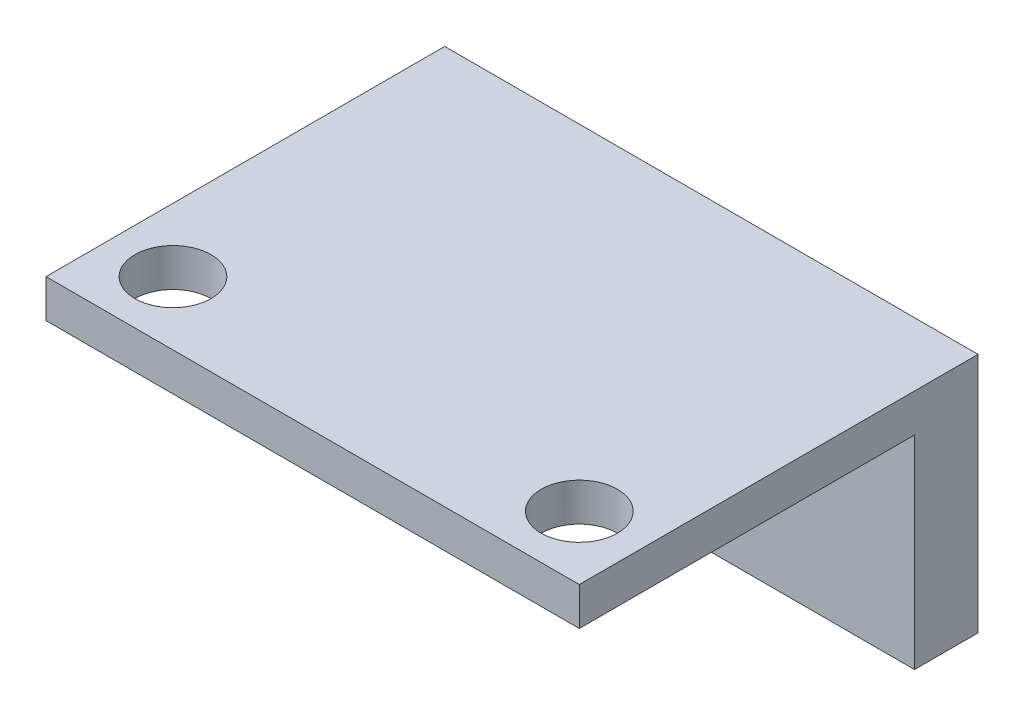
ISO-10303-21;
HEADER;
FILE_DESCRIPTION(('STEP AP214'),'2;1');
FILE_NAME('part.step','',(''),(''),'','','');
FILE_SCHEMA(('AUTOMOTIVE_DESIGN { 1 0 10303 214 1 1 1 1 }'));
ENDSEC;
DATA;
#1=APPLICATION_CONTEXT('core data for automotive mechanical design processes');
#2=APPLICATION_PROTOCOL_DEFINITION('international standard','automotive_design',2000,#1);
#3=PRODUCT_CONTEXT('',#1,'mechanical');
#4=PRODUCT('Part','Part','',(#3));
#5=PRODUCT_RELATED_PRODUCT_CATEGORY('part','',(#4));
#6=PRODUCT_DEFINITION_FORMATION('','',#4);
#7=PRODUCT_DEFINITION_CONTEXT('part definition',#1,'design');
#8=PRODUCT_DEFINITION('design','',#6,#7);
#9=PRODUCT_DEFINITION_SHAPE('','',#8);
#10=(LENGTH_UNIT() NAMED_UNIT(*) SI_UNIT(.MILLI.,.METRE.));
#11=(NAMED_UNIT(*) PLANE_ANGLE_UNIT() SI_UNIT($,.RADIAN.));
#12=(NAMED_UNIT(*) SI_UNIT($,.STERADIAN.) SOLID_ANGLE_UNIT());
#13=UNCERTAINTY_MEASURE_WITH_UNIT(LENGTH_MEASURE(1.E-05),#10,'distance_accuracy_value','');
#14=(GEOMETRIC_REPRESENTATION_CONTEXT(3) GLOBAL_UNCERTAINTY_ASSIGNED_CONTEXT((#13)) GLOBAL_UNIT_ASSIGNED_CONTEXT((#10,
#11,#12)) REPRESENTATION_CONTEXT('',''));
#15=CARTESIAN_POINT('',(0.,0.,0.));
#16=DIRECTION('',(0.,0.,1.));
#17=DIRECTION('',(1.,0.,0.));
#18=AXIS2_PLACEMENT_3D('',#15,#16,#17);
#19=CARTESIAN_POINT('',(0.,1.5,0.));
#20=DIRECTION('',(1.,0.,0.));
#21=DIRECTION('',(0.,0.,-1.));
#22=AXIS2_PLACEMENT_3D('',#19,#20,#21);
#23=PLANE('',#22);
#24=DIRECTION('',(0.,-1.,0.));
#25=VECTOR('',#24,1.);
#26=CARTESIAN_POINT('',(0.,1.5,-15.7));
#27=LINE('',#26,#25);
#28=CARTESIAN_POINT('',(0.,1.5,-15.7));
#29=VERTEX_POINT('',#28);
#30=CARTESIAN_POINT('',(0.,-8.,-15.7));
#31=VERTEX_POINT('',#30);
#32=EDGE_CURVE('E106',#29,#31,#27,.T.);
#33=ORIENTED_EDGE('',*,*,#32,.T.);
#34=DIRECTION('',(0.,0.,-1.));
#35=VECTOR('',#34,1.);
#36=CARTESIAN_POINT('',(0.,-8.,-15.7));
#37=LINE('',#36,#35);
#38=CARTESIAN_POINT('',(0.,-8.,-13.2));
#39=VERTEX_POINT('',#38);
#40=EDGE_CURVE('E110',#39,#31,#37,.T.);
#41=ORIENTED_EDGE('',*,*,#40,.F.);
#42=DIRECTION('',(0.,1.,0.));
#43=VECTOR('',#42,1.);
#44=CARTESIAN_POINT('',(0.,-8.,-13.2));
#45=LINE('',#44,#43);
#46=CARTESIAN_POINT('',(0.,0.,-13.2));
#47=VERTEX_POINT('',#46);
#48=EDGE_CURVE('E138',#39,#47,#45,.T.);
#49=ORIENTED_EDGE('',*,*,#48,.T.);
#50=DIRECTION('',(0.,0.,1.));
#51=VECTOR('',#50,1.);
#52=CARTESIAN_POINT('',(0.,0.,0.));
#53=LINE('',#52,#51);
#54=CARTESIAN_POINT('',(0.,0.,0.));
#55=VERTEX_POINT('',#54);
#56=EDGE_CURVE('E156',#47,#55,#53,.T.);
#57=ORIENTED_EDGE('',*,*,#56,.T.);
#58=DIRECTION('',(0.,-1.,0.));
#59=VECTOR('',#58,1.);
#60=CARTESIAN_POINT('',(0.,1.5,0.));
#61=LINE('',#60,#59);
#62=CARTESIAN_POINT('',(0.,1.5,0.));
#63=VERTEX_POINT('',#62);
#64=EDGE_CURVE('E11',#63,#55,#61,.T.);
#65=ORIENTED_EDGE('',*,*,#64,.F.);
#66=DIRECTION('',(0.,0.,1.));
#67=VECTOR('',#66,1.);
#68=CARTESIAN_POINT('',(0.,1.5,0.));
#69=LINE('',#68,#67);
#70=EDGE_CURVE('E112',#29,#63,#69,.T.);
#71=ORIENTED_EDGE('',*,*,#70,.F.);
#72=EDGE_LOOP('',(#33,#41,#49,#57,#65,#71));
#73=FACE_BOUND('',#72,.T.);
#74=ADVANCED_FACE('F45',(#73),#23,.F.);
#75=CARTESIAN_POINT('',(0.,1.5,0.));
#76=DIRECTION('',(0.,0.,-1.));
#77=DIRECTION('',(-1.,0.,0.));
#78=AXIS2_PLACEMENT_3D('',#75,#76,#77);
#79=PLANE('',#78);
#80=DIRECTION('',(1.,0.,0.));
#81=VECTOR('',#80,1.);
#82=CARTESIAN_POINT('',(0.,0.,0.));
#83=LINE('',#82,#81);
#84=CARTESIAN_POINT('',(21.,0.,0.));
#85=VERTEX_POINT('',#84);
#86=EDGE_CURVE('E84',#55,#85,#83,.T.);
#87=ORIENTED_EDGE('',*,*,#86,.T.);
#88=DIRECTION('',(0.,-1.,0.));
#89=VECTOR('',#88,1.);
#90=CARTESIAN_POINT('',(21.,1.5,0.));
#91=LINE('',#90,#89);
#92=CARTESIAN_POINT('',(21.,1.5,0.));
#93=VERTEX_POINT('',#92);
#94=EDGE_CURVE('E53',#93,#85,#91,.T.);
#95=ORIENTED_EDGE('',*,*,#94,.F.);
#96=DIRECTION('',(1.,0.,0.));
#97=VECTOR('',#96,1.);
#98=CARTESIAN_POINT('',(0.,1.5,0.));
#99=LINE('',#98,#97);
#100=EDGE_CURVE('E89',#63,#93,#99,.T.);
#101=ORIENTED_EDGE('',*,*,#100,.F.);
#102=ORIENTED_EDGE('',*,*,#64,.T.);
#103=EDGE_LOOP('',(#87,#95,#101,#102));
#104=FACE_BOUND('',#103,.T.);
#105=ADVANCED_FACE('F187',(#104),#79,.F.);
#106=CARTESIAN_POINT('',(21.,1.5,0.));
#107=DIRECTION('',(-1.,0.,0.));
#108=DIRECTION('',(0.,0.,1.));
#109=AXIS2_PLACEMENT_3D('',#106,#107,#108);
#110=PLANE('',#109);
#111=DIRECTION('',(0.,0.,-1.));
#112=VECTOR('',#111,1.);
#113=CARTESIAN_POINT('',(21.,0.,0.));
#114=LINE('',#113,#112);
#115=CARTESIAN_POINT('',(21.,0.,-13.2));
#116=VERTEX_POINT('',#115);
#117=EDGE_CURVE('E165',#85,#116,#114,.T.);
#118=ORIENTED_EDGE('',*,*,#117,.T.);
#119=DIRECTION('',(0.,1.,0.));
#120=VECTOR('',#119,1.);
#121=CARTESIAN_POINT('',(21.,-8.,-13.2));
#122=LINE('',#121,#120);
#123=CARTESIAN_POINT('',(21.,-8.,-13.2));
#124=VERTEX_POINT('',#123);
#125=EDGE_CURVE('E142',#124,#116,#122,.T.);
#126=ORIENTED_EDGE('',*,*,#125,.F.);
#127=DIRECTION('',(0.,0.,1.));
#128=VECTOR('',#127,1.);
#129=CARTESIAN_POINT('',(21.,-8.,-15.7));
#130=LINE('',#129,#128);
#131=CARTESIAN_POINT('',(21.,-8.,-15.7));
#132=VERTEX_POINT('',#131);
#133=EDGE_CURVE('E124',#132,#124,#130,.T.);
#134=ORIENTED_EDGE('',*,*,#133,.F.);
#135=DIRECTION('',(0.,-1.,0.));
#136=VECTOR('',#135,1.);
#137=CARTESIAN_POINT('',(21.,1.5,-15.7));
#138=LINE('',#137,#136);
#139=CARTESIAN_POINT('',(21.,1.5,-15.7));
#140=VERTEX_POINT('',#139);
#141=EDGE_CURVE('E115',#140,#132,#138,.T.);
#142=ORIENTED_EDGE('',*,*,#141,.F.);
#143=DIRECTION('',(0.,0.,-1.));
#144=VECTOR('',#143,1.);
#145=CARTESIAN_POINT('',(21.,1.5,0.));
#146=LINE('',#145,#144);
#147=EDGE_CURVE('E168',#93,#140,#146,.T.);
#148=ORIENTED_EDGE('',*,*,#147,.F.);
#149=ORIENTED_EDGE('',*,*,#94,.T.);
#150=EDGE_LOOP('',(#118,#126,#134,#142,#148,#149));
#151=FACE_BOUND('',#150,.T.);
#152=ADVANCED_FACE('F183',(#151),#110,.F.);
#153=CARTESIAN_POINT('',(0.,1.5,-15.7));
#154=DIRECTION('',(0.,0.,1.));
#155=DIRECTION('',(1.,0.,0.));
#156=AXIS2_PLACEMENT_3D('',#153,#154,#155);
#157=PLANE('',#156);
#158=ORIENTED_EDGE('',*,*,#141,.T.);
#159=DIRECTION('',(1.,0.,0.));
#160=VECTOR('',#159,1.);
#161=CARTESIAN_POINT('',(0.,-8.,-15.7));
#162=LINE('',#161,#160);
#163=EDGE_CURVE('E118',#31,#132,#162,.T.);
#164=ORIENTED_EDGE('',*,*,#163,.F.);
#165=ORIENTED_EDGE('',*,*,#32,.F.);
#166=DIRECTION('',(-1.,0.,0.));
#167=VECTOR('',#166,1.);
#168=CARTESIAN_POINT('',(0.,1.5,-15.7));
#169=LINE('',#168,#167);
#170=EDGE_CURVE('E69',#140,#29,#169,.T.);
#171=ORIENTED_EDGE('',*,*,#170,.F.);
#172=EDGE_LOOP('',(#158,#164,#165,#171));
#173=FACE_BOUND('',#172,.T.);
#174=ADVANCED_FACE('F119',(#173),#157,.F.);
#175=CARTESIAN_POINT('',(0.,1.5,0.));
#176=DIRECTION('',(0.,-1.,0.));
#177=DIRECTION('',(0.,0.,-1.));
#178=AXIS2_PLACEMENT_3D('',#175,#176,#177);
#179=PLANE('',#178);
#180=CARTESIAN_POINT('',(2.5,1.5,-2.5));
#181=DIRECTION('',(0.,1.,0.));
#182=DIRECTION('',(0.,0.,1.));
#183=AXIS2_PLACEMENT_3D('',#180,#181,#182);
#184=CIRCLE('',#183,1.5);
#185=CARTESIAN_POINT('',(2.5,1.5,-1.));
#186=VERTEX_POINT('',#185);
#187=EDGE_CURVE('E147',#186,#186,#184,.T.);
#188=ORIENTED_EDGE('',*,*,#187,.F.);
#189=EDGE_LOOP('',(#188));
#190=FACE_BOUND('',#189,.T.);
#191=CARTESIAN_POINT('',(18.5,1.5,-2.5));
#192=DIRECTION('',(0.,1.,0.));
#193=DIRECTION('',(0.,0.,1.));
#194=AXIS2_PLACEMENT_3D('',#191,#192,#193);
#195=CIRCLE('',#194,1.5);
#196=CARTESIAN_POINT('',(18.5,1.5,-0.999999999999999));
#197=VERTEX_POINT('',#196);
#198=EDGE_CURVE('E152',#197,#197,#195,.T.);
#199=ORIENTED_EDGE('',*,*,#198,.F.);
#200=EDGE_LOOP('',(#199));
#201=FACE_BOUND('',#200,.T.);
#202=ORIENTED_EDGE('',*,*,#70,.T.);
#203=ORIENTED_EDGE('',*,*,#100,.T.);
#204=ORIENTED_EDGE('',*,*,#147,.T.);
#205=ORIENTED_EDGE('',*,*,#170,.T.);
#206=EDGE_LOOP('',(#202,#203,#204,#205));
#207=FACE_BOUND('',#206,.T.);
#208=ADVANCED_FACE('F214',(#190,#201,#207),#179,.F.);
#209=CARTESIAN_POINT('',(0.,0.,0.));
#210=DIRECTION('',(0.,-1.,0.));
#211=DIRECTION('',(0.,0.,-1.));
#212=AXIS2_PLACEMENT_3D('',#209,#210,#211);
#213=PLANE('',#212);
#214=DIRECTION('',(-1.,0.,0.));
#215=VECTOR('',#214,1.);
#216=CARTESIAN_POINT('',(0.,0.,-13.2));
#217=LINE('',#216,#215);
#218=EDGE_CURVE('E60',#116,#47,#217,.T.);
#219=ORIENTED_EDGE('',*,*,#218,.F.);
#220=ORIENTED_EDGE('',*,*,#117,.F.);
#221=ORIENTED_EDGE('',*,*,#86,.F.);
#222=ORIENTED_EDGE('',*,*,#56,.F.);
#223=EDGE_LOOP('',(#219,#220,#221,#222));
#224=FACE_BOUND('',#223,.T.);
#225=CARTESIAN_POINT('',(2.5,0.,-2.5));
#226=DIRECTION('',(0.,-1.,0.));
#227=DIRECTION('',(0.,0.,-1.));
#228=AXIS2_PLACEMENT_3D('',#225,#226,#227);
#229=CIRCLE('',#228,1.5);
#230=CARTESIAN_POINT('',(2.5,0.,-4.));
#231=VERTEX_POINT('',#230);
#232=EDGE_CURVE('E151',#231,#231,#229,.F.);
#233=ORIENTED_EDGE('',*,*,#232,.T.);
#234=EDGE_LOOP('',(#233));
#235=FACE_BOUND('',#234,.T.);
#236=CARTESIAN_POINT('',(18.5,0.,-2.5));
#237=DIRECTION('',(0.,-1.,0.));
#238=DIRECTION('',(0.,0.,-1.));
#239=AXIS2_PLACEMENT_3D('',#236,#237,#238);
#240=CIRCLE('',#239,1.5);
#241=CARTESIAN_POINT('',(18.5,0.,-4.));
#242=VERTEX_POINT('',#241);
#243=EDGE_CURVE('E146',#242,#242,#240,.F.);
#244=ORIENTED_EDGE('',*,*,#243,.T.);
#245=EDGE_LOOP('',(#244));
#246=FACE_BOUND('',#245,.T.);
#247=ADVANCED_FACE('F185',(#224,#235,#246),#213,.T.);
#248=CARTESIAN_POINT('',(18.5,-4.24264068711929,-2.5));
#249=DIRECTION('',(0.,1.,0.));
#250=DIRECTION('',(0.,0.,1.));
#251=AXIS2_PLACEMENT_3D('',#248,#249,#250);
#252=CYLINDRICAL_SURFACE('',#251,1.5);
#253=ORIENTED_EDGE('',*,*,#198,.T.);
#254=EDGE_LOOP('',(#253));
#255=FACE_BOUND('',#254,.T.);
#256=ORIENTED_EDGE('',*,*,#243,.F.);
#257=EDGE_LOOP('',(#256));
#258=FACE_BOUND('',#257,.T.);
#259=ADVANCED_FACE('F199',(#255,#258),#252,.F.);
#260=CARTESIAN_POINT('',(2.5,-4.24264068711929,-2.5));
#261=DIRECTION('',(0.,1.,0.));
#262=DIRECTION('',(0.,0.,1.));
#263=AXIS2_PLACEMENT_3D('',#260,#261,#262);
#264=CYLINDRICAL_SURFACE('',#263,1.5);
#265=ORIENTED_EDGE('',*,*,#187,.T.);
#266=EDGE_LOOP('',(#265));
#267=FACE_BOUND('',#266,.T.);
#268=ORIENTED_EDGE('',*,*,#232,.F.);
#269=EDGE_LOOP('',(#268));
#270=FACE_BOUND('',#269,.T.);
#271=ADVANCED_FACE('F191',(#267,#270),#264,.F.);
#272=CARTESIAN_POINT('',(0.,-8.,-13.2));
#273=DIRECTION('',(0.,0.,-1.));
#274=DIRECTION('',(-1.,0.,0.));
#275=AXIS2_PLACEMENT_3D('',#272,#273,#274);
#276=PLANE('',#275);
#277=ORIENTED_EDGE('',*,*,#218,.T.);
#278=ORIENTED_EDGE('',*,*,#48,.F.);
#279=DIRECTION('',(-1.,0.,0.));
#280=VECTOR('',#279,1.);
#281=CARTESIAN_POINT('',(0.,-8.,-13.2));
#282=LINE('',#281,#280);
#283=EDGE_CURVE('E128',#124,#39,#282,.T.);
#284=ORIENTED_EDGE('',*,*,#283,.F.);
#285=ORIENTED_EDGE('',*,*,#125,.T.);
#286=EDGE_LOOP('',(#277,#278,#284,#285));
#287=FACE_BOUND('',#286,.T.);
#288=ADVANCED_FACE('F189',(#287),#276,.F.);
#289=CARTESIAN_POINT('',(0.,-8.,0.));
#290=DIRECTION('',(0.,1.,0.));
#291=DIRECTION('',(0.,0.,1.));
#292=AXIS2_PLACEMENT_3D('',#289,#290,#291);
#293=PLANE('',#292);
#294=ORIENTED_EDGE('',*,*,#40,.T.);
#295=ORIENTED_EDGE('',*,*,#163,.T.);
#296=ORIENTED_EDGE('',*,*,#133,.T.);
#297=ORIENTED_EDGE('',*,*,#283,.T.);
#298=EDGE_LOOP('',(#294,#295,#296,#297));
#299=FACE_BOUND('',#298,.T.);
#300=ADVANCED_FACE('F126',(#299),#293,.F.);
#301=CLOSED_SHELL('',(#74,#105,#152,#174,#208,#247,#259,#271,#288,#300));
#302=MANIFOLD_SOLID_BREP('B2',#301);
#303=ADVANCED_BREP_SHAPE_REPRESENTATION('',(#18,#302),#14);
#304=SHAPE_DEFINITION_REPRESENTATION(#9,#303);
ENDSEC;
END-ISO-10303-21;
